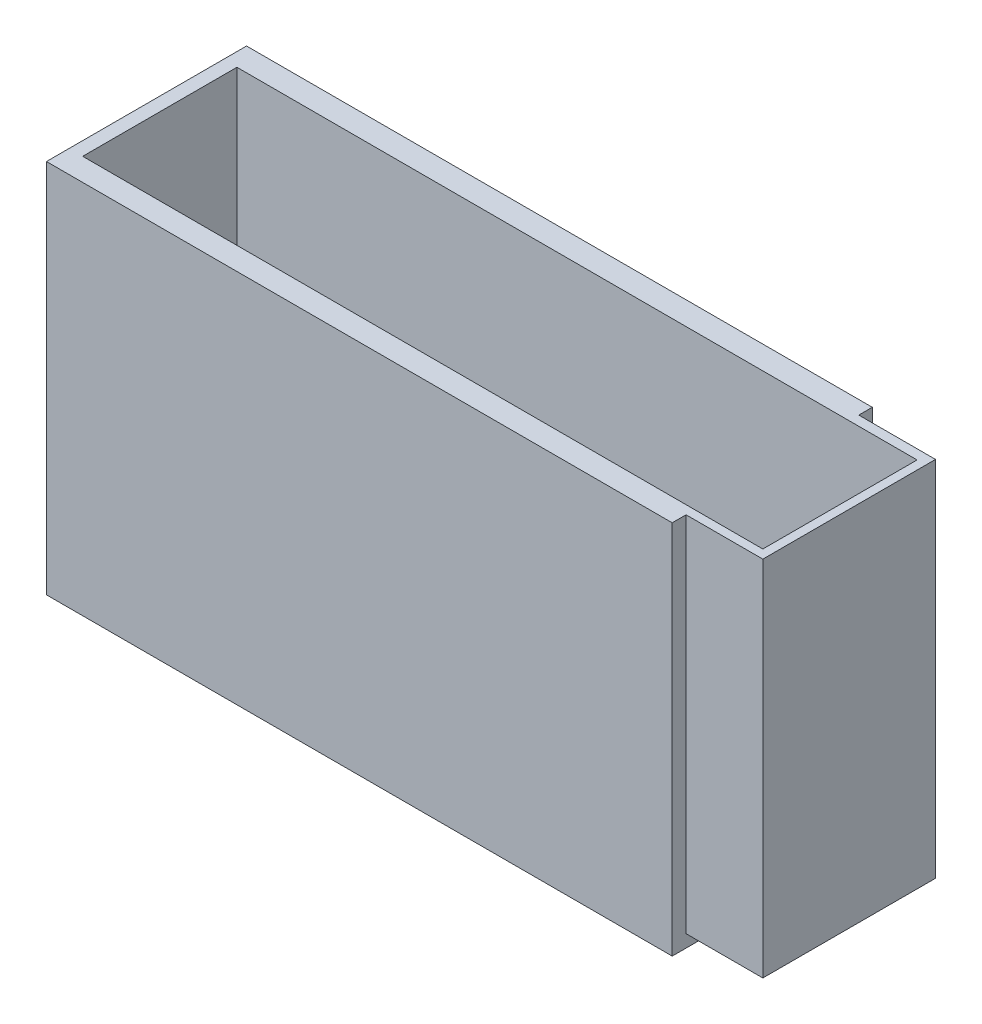
ISO-10303-21;
HEADER;
FILE_DESCRIPTION(('STEP AP214'),'2;1');
FILE_NAME('part.step','',(''),(''),'','','');
FILE_SCHEMA(('AUTOMOTIVE_DESIGN { 1 0 10303 214 1 1 1 1 }'));
ENDSEC;
DATA;
#1=APPLICATION_CONTEXT('core data for automotive mechanical design processes');
#2=APPLICATION_PROTOCOL_DEFINITION('international standard','automotive_design',2000,#1);
#3=PRODUCT_CONTEXT('',#1,'mechanical');
#4=PRODUCT('Part','Part','',(#3));
#5=PRODUCT_RELATED_PRODUCT_CATEGORY('part','',(#4));
#6=PRODUCT_DEFINITION_FORMATION('','',#4);
#7=PRODUCT_DEFINITION_CONTEXT('part definition',#1,'design');
#8=PRODUCT_DEFINITION('design','',#6,#7);
#9=PRODUCT_DEFINITION_SHAPE('','',#8);
#10=(LENGTH_UNIT() NAMED_UNIT(*) SI_UNIT(.MILLI.,.METRE.));
#11=(NAMED_UNIT(*) PLANE_ANGLE_UNIT() SI_UNIT($,.RADIAN.));
#12=(NAMED_UNIT(*) SI_UNIT($,.STERADIAN.) SOLID_ANGLE_UNIT());
#13=UNCERTAINTY_MEASURE_WITH_UNIT(LENGTH_MEASURE(1.E-05),#10,'distance_accuracy_value','');
#14=(GEOMETRIC_REPRESENTATION_CONTEXT(3) GLOBAL_UNCERTAINTY_ASSIGNED_CONTEXT((#13)) GLOBAL_UNIT_ASSIGNED_CONTEXT((#10,
#11,#12)) REPRESENTATION_CONTEXT('',''));
#15=CARTESIAN_POINT('',(0.,0.,0.));
#16=DIRECTION('',(0.,0.,1.));
#17=DIRECTION('',(1.,0.,0.));
#18=AXIS2_PLACEMENT_3D('',#15,#16,#17);
#19=CARTESIAN_POINT('',(126.973910004362,190.5,-115.486645788246));
#20=DIRECTION('',(-1.,0.,0.));
#21=DIRECTION('',(0.,0.,1.));
#22=AXIS2_PLACEMENT_3D('',#19,#20,#21);
#23=PLANE('',#22);
#24=DIRECTION('',(0.,0.,-1.));
#25=VECTOR('',#24,1.);
#26=CARTESIAN_POINT('',(126.973910004362,6.34999999999999,-108.621204623176));
#27=LINE('',#26,#25);
#28=CARTESIAN_POINT('',(126.973910004362,6.34999999999999,-20.9568295211862));
#29=VERTEX_POINT('',#28);
#30=CARTESIAN_POINT('',(126.973910004362,6.34999999999999,-108.621204623176));
#31=VERTEX_POINT('',#30);
#32=EDGE_CURVE('E180',#29,#31,#27,.T.);
#33=ORIENTED_EDGE('',*,*,#32,.F.);
#34=DIRECTION('',(0.,1.,0.));
#35=VECTOR('',#34,1.);
#36=CARTESIAN_POINT('',(126.973910004362,6.34999999999999,-20.9568295211862));
#37=LINE('',#36,#35);
#38=CARTESIAN_POINT('',(126.973910004362,190.5,-20.9568295211862));
#39=VERTEX_POINT('',#38);
#40=EDGE_CURVE('E184',#29,#39,#37,.T.);
#41=ORIENTED_EDGE('',*,*,#40,.T.);
#42=DIRECTION('',(0.,0.,-1.));
#43=VECTOR('',#42,1.);
#44=CARTESIAN_POINT('',(126.973910004362,190.5,-115.486645788246));
#45=LINE('',#44,#43);
#46=CARTESIAN_POINT('',(126.973910004362,190.5,-13.9206629992444));
#47=VERTEX_POINT('',#46);
#48=EDGE_CURVE('E188',#47,#39,#45,.T.);
#49=ORIENTED_EDGE('',*,*,#48,.F.);
#50=DIRECTION('',(0.,-1.,0.));
#51=VECTOR('',#50,1.);
#52=CARTESIAN_POINT('',(126.973910004362,190.5,-13.9206629992444));
#53=LINE('',#52,#51);
#54=CARTESIAN_POINT('',(126.973910004362,0.,-13.9206629992444));
#55=VERTEX_POINT('',#54);
#56=EDGE_CURVE('E197',#47,#55,#53,.T.);
#57=ORIENTED_EDGE('',*,*,#56,.T.);
#58=DIRECTION('',(0.,0.,-1.));
#59=VECTOR('',#58,1.);
#60=CARTESIAN_POINT('',(126.973910004362,0.,-115.486645788246));
#61=LINE('',#60,#59);
#62=CARTESIAN_POINT('',(126.973910004362,0.,-115.486645788246));
#63=VERTEX_POINT('',#62);
#64=EDGE_CURVE('E186',#55,#63,#61,.T.);
#65=ORIENTED_EDGE('',*,*,#64,.T.);
#66=DIRECTION('',(0.,-1.,0.));
#67=VECTOR('',#66,1.);
#68=CARTESIAN_POINT('',(126.973910004362,190.5,-115.486645788246));
#69=LINE('',#68,#67);
#70=CARTESIAN_POINT('',(126.973910004362,190.5,-115.486645788246));
#71=VERTEX_POINT('',#70);
#72=EDGE_CURVE('E11',#71,#63,#69,.T.);
#73=ORIENTED_EDGE('',*,*,#72,.F.);
#74=CARTESIAN_POINT('',(126.973910004362,190.5,-108.621204623176));
#75=VERTEX_POINT('',#74);
#76=EDGE_CURVE('E55',#75,#71,#45,.T.);
#77=ORIENTED_EDGE('',*,*,#76,.F.);
#78=DIRECTION('',(0.,1.,0.));
#79=VECTOR('',#78,1.);
#80=CARTESIAN_POINT('',(126.973910004362,6.34999999999999,-108.621204623176));
#81=LINE('',#80,#79);
#82=EDGE_CURVE('E183',#31,#75,#81,.T.);
#83=ORIENTED_EDGE('',*,*,#82,.F.);
#84=EDGE_LOOP('',(#33,#41,#49,#57,#65,#73,#77,#83));
#85=FACE_BOUND('',#84,.T.);
#86=ADVANCED_FACE('F33',(#85),#23,.F.);
#87=CARTESIAN_POINT('',(-190.66912065179,190.5,-115.486645788246));
#88=DIRECTION('',(0.,0.,1.));
#89=DIRECTION('',(1.,0.,0.));
#90=AXIS2_PLACEMENT_3D('',#87,#88,#89);
#91=PLANE('',#90);
#92=DIRECTION('',(-1.,0.,0.));
#93=VECTOR('',#92,1.);
#94=CARTESIAN_POINT('',(-190.66912065179,0.,-115.486645788246));
#95=LINE('',#94,#93);
#96=CARTESIAN_POINT('',(-190.66912065179,0.,-115.486645788246));
#97=VERTEX_POINT('',#96);
#98=EDGE_CURVE('E200',#63,#97,#95,.T.);
#99=ORIENTED_EDGE('',*,*,#98,.T.);
#100=DIRECTION('',(0.,-1.,0.));
#101=VECTOR('',#100,1.);
#102=CARTESIAN_POINT('',(-190.66912065179,190.5,-115.486645788246));
#103=LINE('',#102,#101);
#104=CARTESIAN_POINT('',(-190.66912065179,190.5,-115.486645788246));
#105=VERTEX_POINT('',#104);
#106=EDGE_CURVE('E40',#105,#97,#103,.T.);
#107=ORIENTED_EDGE('',*,*,#106,.F.);
#108=DIRECTION('',(-1.,0.,0.));
#109=VECTOR('',#108,1.);
#110=CARTESIAN_POINT('',(-190.66912065179,190.5,-115.486645788246));
#111=LINE('',#110,#109);
#112=EDGE_CURVE('E191',#71,#105,#111,.T.);
#113=ORIENTED_EDGE('',*,*,#112,.F.);
#114=ORIENTED_EDGE('',*,*,#72,.T.);
#115=EDGE_LOOP('',(#99,#107,#113,#114));
#116=FACE_BOUND('',#115,.T.);
#117=ADVANCED_FACE('F256',(#116),#91,.F.);
#118=CARTESIAN_POINT('',(-190.66912065179,190.5,-115.486645788246));
#119=DIRECTION('',(1.,0.,0.));
#120=DIRECTION('',(0.,0.,-1.));
#121=AXIS2_PLACEMENT_3D('',#118,#119,#120);
#122=PLANE('',#121);
#123=DIRECTION('',(0.,0.,1.));
#124=VECTOR('',#123,1.);
#125=CARTESIAN_POINT('',(-190.66912065179,0.,-115.486645788246));
#126=LINE('',#125,#124);
#127=CARTESIAN_POINT('',(-190.66912065179,0.,-13.9206629992444));
#128=VERTEX_POINT('',#127);
#129=EDGE_CURVE('E202',#97,#128,#126,.T.);
#130=ORIENTED_EDGE('',*,*,#129,.T.);
#131=DIRECTION('',(0.,-1.,0.));
#132=VECTOR('',#131,1.);
#133=CARTESIAN_POINT('',(-190.66912065179,190.5,-13.9206629992444));
#134=LINE('',#133,#132);
#135=CARTESIAN_POINT('',(-190.66912065179,190.5,-13.9206629992444));
#136=VERTEX_POINT('',#135);
#137=EDGE_CURVE('E208',#136,#128,#134,.T.);
#138=ORIENTED_EDGE('',*,*,#137,.F.);
#139=DIRECTION('',(0.,0.,1.));
#140=VECTOR('',#139,1.);
#141=CARTESIAN_POINT('',(-190.66912065179,190.5,-115.486645788246));
#142=LINE('',#141,#140);
#143=EDGE_CURVE('E193',#105,#136,#142,.T.);
#144=ORIENTED_EDGE('',*,*,#143,.F.);
#145=ORIENTED_EDGE('',*,*,#106,.T.);
#146=EDGE_LOOP('',(#130,#138,#144,#145));
#147=FACE_BOUND('',#146,.T.);
#148=ADVANCED_FACE('F215',(#147),#122,.F.);
#149=CARTESIAN_POINT('',(-190.66912065179,190.5,-13.9206629992444));
#150=DIRECTION('',(0.,0.,-1.));
#151=DIRECTION('',(-1.,0.,0.));
#152=AXIS2_PLACEMENT_3D('',#149,#150,#151);
#153=PLANE('',#152);
#154=DIRECTION('',(1.,0.,0.));
#155=VECTOR('',#154,1.);
#156=CARTESIAN_POINT('',(-190.66912065179,0.,-13.9206629992444));
#157=LINE('',#156,#155);
#158=EDGE_CURVE('E204',#128,#55,#157,.T.);
#159=ORIENTED_EDGE('',*,*,#158,.T.);
#160=ORIENTED_EDGE('',*,*,#56,.F.);
#161=DIRECTION('',(1.,0.,0.));
#162=VECTOR('',#161,1.);
#163=CARTESIAN_POINT('',(-190.66912065179,190.5,-13.9206629992444));
#164=LINE('',#163,#162);
#165=EDGE_CURVE('E195',#136,#47,#164,.T.);
#166=ORIENTED_EDGE('',*,*,#165,.F.);
#167=ORIENTED_EDGE('',*,*,#137,.T.);
#168=EDGE_LOOP('',(#159,#160,#166,#167));
#169=FACE_BOUND('',#168,.T.);
#170=ADVANCED_FACE('F225',(#169),#153,.F.);
#171=CARTESIAN_POINT('',(0.,190.5,0.));
#172=DIRECTION('',(0.,1.,0.));
#173=DIRECTION('',(0.,0.,1.));
#174=AXIS2_PLACEMENT_3D('',#171,#172,#173);
#175=PLANE('',#174);
#176=DIRECTION('',(0.,0.,-1.));
#177=VECTOR('',#176,1.);
#178=CARTESIAN_POINT('',(161.500459406713,190.5,-103.699728494232));
#179=LINE('',#178,#177);
#180=CARTESIAN_POINT('',(161.500459406713,190.5,-25.3993109327824));
#181=VERTEX_POINT('',#180);
#182=CARTESIAN_POINT('',(161.500459406713,190.5,-103.699728494232));
#183=VERTEX_POINT('',#182);
#184=EDGE_CURVE('E47',#181,#183,#179,.T.);
#185=ORIENTED_EDGE('',*,*,#184,.F.);
#186=DIRECTION('',(1.,0.,0.));
#187=VECTOR('',#186,1.);
#188=CARTESIAN_POINT('',(161.500459406713,190.5,-25.3993109327824));
#189=LINE('',#188,#187);
#190=CARTESIAN_POINT('',(-183.761224328811,190.5,-25.3993109327824));
#191=VERTEX_POINT('',#190);
#192=EDGE_CURVE('E141',#191,#181,#189,.T.);
#193=ORIENTED_EDGE('',*,*,#192,.F.);
#194=DIRECTION('',(0.,0.,1.));
#195=VECTOR('',#194,1.);
#196=CARTESIAN_POINT('',(-183.761224328811,190.5,-103.699728494232));
#197=LINE('',#196,#195);
#198=CARTESIAN_POINT('',(-183.761224328811,190.5,-103.699728494232));
#199=VERTEX_POINT('',#198);
#200=EDGE_CURVE('E144',#199,#191,#197,.T.);
#201=ORIENTED_EDGE('',*,*,#200,.F.);
#202=DIRECTION('',(-1.,0.,0.));
#203=VECTOR('',#202,1.);
#204=CARTESIAN_POINT('',(161.500459406713,190.5,-103.699728494232));
#205=LINE('',#204,#203);
#206=EDGE_CURVE('E150',#183,#199,#205,.T.);
#207=ORIENTED_EDGE('',*,*,#206,.F.);
#208=EDGE_LOOP('',(#185,#193,#201,#207));
#209=FACE_BOUND('',#208,.T.);
#210=ORIENTED_EDGE('',*,*,#48,.T.);
#211=DIRECTION('',(-1.,0.,0.));
#212=VECTOR('',#211,1.);
#213=CARTESIAN_POINT('',(165.942200845866,190.5,-20.9568295211862));
#214=LINE('',#213,#212);
#215=CARTESIAN_POINT('',(165.942200845866,190.5,-20.9568295211862));
#216=VERTEX_POINT('',#215);
#217=EDGE_CURVE('E168',#216,#39,#214,.T.);
#218=ORIENTED_EDGE('',*,*,#217,.F.);
#219=DIRECTION('',(0.,0.,1.));
#220=VECTOR('',#219,1.);
#221=CARTESIAN_POINT('',(165.942200845866,190.5,-20.9568295211862));
#222=LINE('',#221,#220);
#223=CARTESIAN_POINT('',(165.942200845866,190.5,-108.621204623176));
#224=VERTEX_POINT('',#223);
#225=EDGE_CURVE('E166',#224,#216,#222,.T.);
#226=ORIENTED_EDGE('',*,*,#225,.F.);
#227=DIRECTION('',(-1.,0.,0.));
#228=VECTOR('',#227,1.);
#229=CARTESIAN_POINT('',(165.942200845866,190.5,-108.621204623176));
#230=LINE('',#229,#228);
#231=EDGE_CURVE('E171',#224,#75,#230,.T.);
#232=ORIENTED_EDGE('',*,*,#231,.T.);
#233=ORIENTED_EDGE('',*,*,#76,.T.);
#234=ORIENTED_EDGE('',*,*,#112,.T.);
#235=ORIENTED_EDGE('',*,*,#143,.T.);
#236=ORIENTED_EDGE('',*,*,#165,.T.);
#237=EDGE_LOOP('',(#210,#218,#226,#232,#233,#234,#235,#236));
#238=FACE_BOUND('',#237,.T.);
#239=ADVANCED_FACE('F231',(#209,#238),#175,.T.);
#240=CARTESIAN_POINT('',(0.,0.,0.));
#241=DIRECTION('',(0.,1.,0.));
#242=DIRECTION('',(0.,0.,1.));
#243=AXIS2_PLACEMENT_3D('',#240,#241,#242);
#244=PLANE('',#243);
#245=ORIENTED_EDGE('',*,*,#64,.F.);
#246=ORIENTED_EDGE('',*,*,#158,.F.);
#247=ORIENTED_EDGE('',*,*,#129,.F.);
#248=ORIENTED_EDGE('',*,*,#98,.F.);
#249=EDGE_LOOP('',(#245,#246,#247,#248));
#250=FACE_BOUND('',#249,.T.);
#251=ADVANCED_FACE('F222',(#250),#244,.F.);
#252=CARTESIAN_POINT('',(165.942200845866,6.34999999999999,-20.9568295211862));
#253=DIRECTION('',(0.,1.,0.));
#254=DIRECTION('',(0.,0.,1.));
#255=AXIS2_PLACEMENT_3D('',#252,#253,#254);
#256=PLANE('',#255);
#257=DIRECTION('',(-1.,0.,0.));
#258=VECTOR('',#257,1.);
#259=CARTESIAN_POINT('',(165.942200845866,6.34999999999999,-20.9568295211862));
#260=LINE('',#259,#258);
#261=CARTESIAN_POINT('',(165.942200845866,6.34999999999999,-20.9568295211862));
#262=VERTEX_POINT('',#261);
#263=EDGE_CURVE('E177',#262,#29,#260,.T.);
#264=ORIENTED_EDGE('',*,*,#263,.T.);
#265=ORIENTED_EDGE('',*,*,#32,.T.);
#266=DIRECTION('',(-1.,0.,0.));
#267=VECTOR('',#266,1.);
#268=CARTESIAN_POINT('',(165.942200845866,6.34999999999999,-108.621204623176));
#269=LINE('',#268,#267);
#270=CARTESIAN_POINT('',(165.942200845866,6.34999999999999,-108.621204623176));
#271=VERTEX_POINT('',#270);
#272=EDGE_CURVE('E174',#271,#31,#269,.T.);
#273=ORIENTED_EDGE('',*,*,#272,.F.);
#274=DIRECTION('',(0.,0.,-1.));
#275=VECTOR('',#274,1.);
#276=CARTESIAN_POINT('',(165.942200845866,6.34999999999999,-20.9568295211862));
#277=LINE('',#276,#275);
#278=EDGE_CURVE('E162',#262,#271,#277,.T.);
#279=ORIENTED_EDGE('',*,*,#278,.F.);
#280=EDGE_LOOP('',(#264,#265,#273,#279));
#281=FACE_BOUND('',#280,.T.);
#282=ADVANCED_FACE('F245',(#281),#256,.F.);
#283=CARTESIAN_POINT('',(165.942200845866,190.5,-20.9568295211862));
#284=DIRECTION('',(0.,0.,-1.));
#285=DIRECTION('',(-1.,0.,0.));
#286=AXIS2_PLACEMENT_3D('',#283,#284,#285);
#287=PLANE('',#286);
#288=ORIENTED_EDGE('',*,*,#217,.T.);
#289=ORIENTED_EDGE('',*,*,#40,.F.);
#290=ORIENTED_EDGE('',*,*,#263,.F.);
#291=DIRECTION('',(0.,-1.,0.));
#292=VECTOR('',#291,1.);
#293=CARTESIAN_POINT('',(165.942200845866,190.5,-20.9568295211862));
#294=LINE('',#293,#292);
#295=EDGE_CURVE('E156',#216,#262,#294,.T.);
#296=ORIENTED_EDGE('',*,*,#295,.F.);
#297=EDGE_LOOP('',(#288,#289,#290,#296));
#298=FACE_BOUND('',#297,.T.);
#299=ADVANCED_FACE('F235',(#298),#287,.F.);
#300=CARTESIAN_POINT('',(165.942200845866,190.5,-108.621204623176));
#301=DIRECTION('',(0.,0.,1.));
#302=DIRECTION('',(1.,0.,0.));
#303=AXIS2_PLACEMENT_3D('',#300,#301,#302);
#304=PLANE('',#303);
#305=ORIENTED_EDGE('',*,*,#272,.T.);
#306=ORIENTED_EDGE('',*,*,#82,.T.);
#307=ORIENTED_EDGE('',*,*,#231,.F.);
#308=DIRECTION('',(0.,1.,0.));
#309=VECTOR('',#308,1.);
#310=CARTESIAN_POINT('',(165.942200845866,190.5,-108.621204623176));
#311=LINE('',#310,#309);
#312=EDGE_CURVE('E164',#271,#224,#311,.T.);
#313=ORIENTED_EDGE('',*,*,#312,.F.);
#314=EDGE_LOOP('',(#305,#306,#307,#313));
#315=FACE_BOUND('',#314,.T.);
#316=ADVANCED_FACE('F243',(#315),#304,.F.);
#317=CARTESIAN_POINT('',(165.942200845866,0.,0.));
#318=DIRECTION('',(1.,0.,0.));
#319=DIRECTION('',(0.,0.,-1.));
#320=AXIS2_PLACEMENT_3D('',#317,#318,#319);
#321=PLANE('',#320);
#322=ORIENTED_EDGE('',*,*,#295,.T.);
#323=ORIENTED_EDGE('',*,*,#278,.T.);
#324=ORIENTED_EDGE('',*,*,#312,.T.);
#325=ORIENTED_EDGE('',*,*,#225,.T.);
#326=EDGE_LOOP('',(#322,#323,#324,#325));
#327=FACE_BOUND('',#326,.T.);
#328=ADVANCED_FACE('F238',(#327),#321,.T.);
#329=CARTESIAN_POINT('',(161.500459406713,8.89000000000001,-103.699728494232));
#330=DIRECTION('',(1.,0.,0.));
#331=DIRECTION('',(0.,0.,-1.));
#332=AXIS2_PLACEMENT_3D('',#329,#330,#331);
#333=PLANE('',#332);
#334=ORIENTED_EDGE('',*,*,#184,.T.);
#335=DIRECTION('',(0.,1.,0.));
#336=VECTOR('',#335,1.);
#337=CARTESIAN_POINT('',(161.500459406713,8.89000000000001,-103.699728494232));
#338=LINE('',#337,#336);
#339=CARTESIAN_POINT('',(161.500459406713,8.89000000000001,-103.699728494232));
#340=VERTEX_POINT('',#339);
#341=EDGE_CURVE('E119',#340,#183,#338,.T.);
#342=ORIENTED_EDGE('',*,*,#341,.F.);
#343=DIRECTION('',(0.,0.,-1.));
#344=VECTOR('',#343,1.);
#345=CARTESIAN_POINT('',(161.500459406713,8.89000000000001,-103.699728494232));
#346=LINE('',#345,#344);
#347=CARTESIAN_POINT('',(161.500459406713,8.89000000000001,-25.3993109327824));
#348=VERTEX_POINT('',#347);
#349=EDGE_CURVE('E123',#348,#340,#346,.T.);
#350=ORIENTED_EDGE('',*,*,#349,.F.);
#351=DIRECTION('',(0.,1.,0.));
#352=VECTOR('',#351,1.);
#353=CARTESIAN_POINT('',(161.500459406713,8.89000000000001,-25.3993109327824));
#354=LINE('',#353,#352);
#355=EDGE_CURVE('E154',#348,#181,#354,.T.);
#356=ORIENTED_EDGE('',*,*,#355,.T.);
#357=EDGE_LOOP('',(#334,#342,#350,#356));
#358=FACE_BOUND('',#357,.T.);
#359=ADVANCED_FACE('F121',(#358),#333,.F.);
#360=CARTESIAN_POINT('',(161.500459406713,8.89000000000001,-25.3993109327824));
#361=DIRECTION('',(0.,0.,1.));
#362=DIRECTION('',(1.,0.,0.));
#363=AXIS2_PLACEMENT_3D('',#360,#361,#362);
#364=PLANE('',#363);
#365=ORIENTED_EDGE('',*,*,#192,.T.);
#366=ORIENTED_EDGE('',*,*,#355,.F.);
#367=DIRECTION('',(1.,0.,0.));
#368=VECTOR('',#367,1.);
#369=CARTESIAN_POINT('',(161.500459406713,8.89000000000001,-25.3993109327824));
#370=LINE('',#369,#368);
#371=CARTESIAN_POINT('',(-183.761224328811,8.89000000000001,-25.3993109327824));
#372=VERTEX_POINT('',#371);
#373=EDGE_CURVE('E129',#372,#348,#370,.T.);
#374=ORIENTED_EDGE('',*,*,#373,.F.);
#375=DIRECTION('',(0.,1.,0.));
#376=VECTOR('',#375,1.);
#377=CARTESIAN_POINT('',(-183.761224328811,8.89000000000001,-25.3993109327824));
#378=LINE('',#377,#376);
#379=EDGE_CURVE('E157',#372,#191,#378,.T.);
#380=ORIENTED_EDGE('',*,*,#379,.T.);
#381=EDGE_LOOP('',(#365,#366,#374,#380));
#382=FACE_BOUND('',#381,.T.);
#383=ADVANCED_FACE('F276',(#382),#364,.F.);
#384=CARTESIAN_POINT('',(-183.761224328811,8.89000000000001,-103.699728494232));
#385=DIRECTION('',(-1.,0.,0.));
#386=DIRECTION('',(0.,0.,1.));
#387=AXIS2_PLACEMENT_3D('',#384,#385,#386);
#388=PLANE('',#387);
#389=ORIENTED_EDGE('',*,*,#200,.T.);
#390=ORIENTED_EDGE('',*,*,#379,.F.);
#391=DIRECTION('',(0.,0.,1.));
#392=VECTOR('',#391,1.);
#393=CARTESIAN_POINT('',(-183.761224328811,8.89000000000001,-103.699728494232));
#394=LINE('',#393,#392);
#395=CARTESIAN_POINT('',(-183.761224328811,8.89000000000001,-103.699728494232));
#396=VERTEX_POINT('',#395);
#397=EDGE_CURVE('E137',#396,#372,#394,.T.);
#398=ORIENTED_EDGE('',*,*,#397,.F.);
#399=DIRECTION('',(0.,1.,0.));
#400=VECTOR('',#399,1.);
#401=CARTESIAN_POINT('',(-183.761224328811,8.89000000000001,-103.699728494232));
#402=LINE('',#401,#400);
#403=EDGE_CURVE('E128',#396,#199,#402,.T.);
#404=ORIENTED_EDGE('',*,*,#403,.T.);
#405=EDGE_LOOP('',(#389,#390,#398,#404));
#406=FACE_BOUND('',#405,.T.);
#407=ADVANCED_FACE('F274',(#406),#388,.F.);
#408=CARTESIAN_POINT('',(161.500459406713,8.89000000000001,-103.699728494232));
#409=DIRECTION('',(0.,0.,-1.));
#410=DIRECTION('',(-1.,0.,0.));
#411=AXIS2_PLACEMENT_3D('',#408,#409,#410);
#412=PLANE('',#411);
#413=ORIENTED_EDGE('',*,*,#206,.T.);
#414=ORIENTED_EDGE('',*,*,#403,.F.);
#415=DIRECTION('',(-1.,0.,0.));
#416=VECTOR('',#415,1.);
#417=CARTESIAN_POINT('',(161.500459406713,8.89000000000001,-103.699728494232));
#418=LINE('',#417,#416);
#419=EDGE_CURVE('E132',#340,#396,#418,.T.);
#420=ORIENTED_EDGE('',*,*,#419,.F.);
#421=ORIENTED_EDGE('',*,*,#341,.T.);
#422=EDGE_LOOP('',(#413,#414,#420,#421));
#423=FACE_BOUND('',#422,.T.);
#424=ADVANCED_FACE('F133',(#423),#412,.F.);
#425=CARTESIAN_POINT('',(0.,8.89000000000001,0.));
#426=DIRECTION('',(0.,-1.,0.));
#427=DIRECTION('',(0.,0.,-1.));
#428=AXIS2_PLACEMENT_3D('',#425,#426,#427);
#429=PLANE('',#428);
#430=ORIENTED_EDGE('',*,*,#349,.T.);
#431=ORIENTED_EDGE('',*,*,#419,.T.);
#432=ORIENTED_EDGE('',*,*,#397,.T.);
#433=ORIENTED_EDGE('',*,*,#373,.T.);
#434=EDGE_LOOP('',(#430,#431,#432,#433));
#435=FACE_BOUND('',#434,.T.);
#436=ADVANCED_FACE('F139',(#435),#429,.F.);
#437=CLOSED_SHELL('',(#86,#117,#148,#170,#239,#251,#282,#299,#316,#328,#359,#383,#407,#424,#436));
#438=MANIFOLD_SOLID_BREP('B2',#437);
#439=ADVANCED_BREP_SHAPE_REPRESENTATION('',(#18,#438),#14);
#440=SHAPE_DEFINITION_REPRESENTATION(#9,#439);
ENDSEC;
END-ISO-10303-21;
